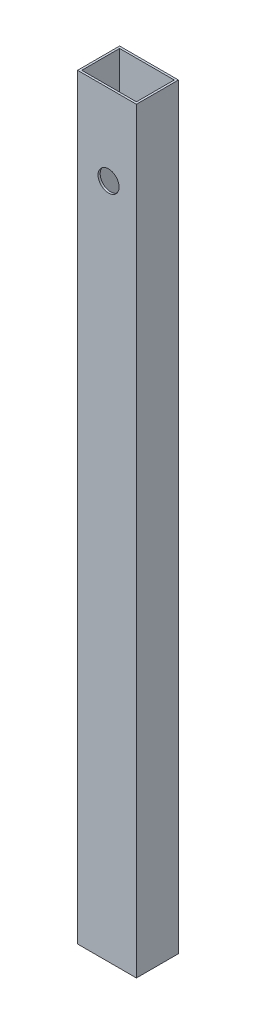
ISO-10303-21;
HEADER;
FILE_DESCRIPTION(('STEP AP214'),'2;1');
FILE_NAME('part.step','',(''),(''),'','','');
FILE_SCHEMA(('AUTOMOTIVE_DESIGN { 1 0 10303 214 1 1 1 1 }'));
ENDSEC;
DATA;
#1=APPLICATION_CONTEXT('core data for automotive mechanical design processes');
#2=APPLICATION_PROTOCOL_DEFINITION('international standard','automotive_design',2000,#1);
#3=PRODUCT_CONTEXT('',#1,'mechanical');
#4=PRODUCT('Part','Part','',(#3));
#5=PRODUCT_RELATED_PRODUCT_CATEGORY('part','',(#4));
#6=PRODUCT_DEFINITION_FORMATION('','',#4);
#7=PRODUCT_DEFINITION_CONTEXT('part definition',#1,'design');
#8=PRODUCT_DEFINITION('design','',#6,#7);
#9=PRODUCT_DEFINITION_SHAPE('','',#8);
#10=(LENGTH_UNIT() NAMED_UNIT(*) SI_UNIT(.MILLI.,.METRE.));
#11=(NAMED_UNIT(*) PLANE_ANGLE_UNIT() SI_UNIT($,.RADIAN.));
#12=(NAMED_UNIT(*) SI_UNIT($,.STERADIAN.) SOLID_ANGLE_UNIT());
#13=UNCERTAINTY_MEASURE_WITH_UNIT(LENGTH_MEASURE(1.E-05),#10,'distance_accuracy_value','');
#14=(GEOMETRIC_REPRESENTATION_CONTEXT(3) GLOBAL_UNCERTAINTY_ASSIGNED_CONTEXT((#13)) GLOBAL_UNIT_ASSIGNED_CONTEXT((#10,
#11,#12)) REPRESENTATION_CONTEXT('',''));
#15=CARTESIAN_POINT('',(0.,0.,0.));
#16=DIRECTION('',(0.,0.,1.));
#17=DIRECTION('',(1.,0.,0.));
#18=AXIS2_PLACEMENT_3D('',#15,#16,#17);
#19=CARTESIAN_POINT('',(17.78,457.2,-12.7));
#20=DIRECTION('',(-1.,0.,0.));
#21=DIRECTION('',(0.,0.,1.));
#22=AXIS2_PLACEMENT_3D('',#19,#20,#21);
#23=PLANE('',#22);
#24=DIRECTION('',(0.,0.,-1.));
#25=VECTOR('',#24,1.);
#26=CARTESIAN_POINT('',(17.78,0.,-12.7));
#27=LINE('',#26,#25);
#28=CARTESIAN_POINT('',(17.78,0.,12.7));
#29=VERTEX_POINT('',#28);
#30=CARTESIAN_POINT('',(17.78,0.,-12.7));
#31=VERTEX_POINT('',#30);
#32=EDGE_CURVE('E159',#29,#31,#27,.T.);
#33=ORIENTED_EDGE('',*,*,#32,.T.);
#34=DIRECTION('',(0.,-1.,0.));
#35=VECTOR('',#34,1.);
#36=CARTESIAN_POINT('',(17.78,457.2,-12.7));
#37=LINE('',#36,#35);
#38=CARTESIAN_POINT('',(17.78,457.2,-12.7));
#39=VERTEX_POINT('',#38);
#40=EDGE_CURVE('E11',#39,#31,#37,.T.);
#41=ORIENTED_EDGE('',*,*,#40,.F.);
#42=DIRECTION('',(0.,0.,-1.));
#43=VECTOR('',#42,1.);
#44=CARTESIAN_POINT('',(17.78,457.2,-12.7));
#45=LINE('',#44,#43);
#46=CARTESIAN_POINT('',(17.78,457.2,12.7));
#47=VERTEX_POINT('',#46);
#48=EDGE_CURVE('E165',#47,#39,#45,.T.);
#49=ORIENTED_EDGE('',*,*,#48,.F.);
#50=DIRECTION('',(0.,-1.,0.));
#51=VECTOR('',#50,1.);
#52=CARTESIAN_POINT('',(17.78,457.2,12.7));
#53=LINE('',#52,#51);
#54=EDGE_CURVE('E179',#47,#29,#53,.T.);
#55=ORIENTED_EDGE('',*,*,#54,.T.);
#56=EDGE_LOOP('',(#33,#41,#49,#55));
#57=FACE_BOUND('',#56,.T.);
#58=ADVANCED_FACE('F47',(#57),#23,.F.);
#59=CARTESIAN_POINT('',(-17.78,457.2,-12.7));
#60=DIRECTION('',(0.,0.,1.));
#61=DIRECTION('',(1.,0.,0.));
#62=AXIS2_PLACEMENT_3D('',#59,#60,#61);
#63=PLANE('',#62);
#64=CARTESIAN_POINT('',(0.954776225867732,408.643423164839,-12.7));
#65=DIRECTION('',(0.,0.,-1.));
#66=DIRECTION('',(-1.,0.,0.));
#67=AXIS2_PLACEMENT_3D('',#64,#65,#66);
#68=CIRCLE('',#67,6.34999999999999);
#69=CARTESIAN_POINT('',(-5.39522377413225,408.643423164839,-12.7));
#70=VERTEX_POINT('',#69);
#71=EDGE_CURVE('E260',#70,#70,#68,.T.);
#72=ORIENTED_EDGE('',*,*,#71,.F.);
#73=EDGE_LOOP('',(#72));
#74=FACE_BOUND('',#73,.T.);
#75=DIRECTION('',(-1.,0.,0.));
#76=VECTOR('',#75,1.);
#77=CARTESIAN_POINT('',(-17.78,0.,-12.7));
#78=LINE('',#77,#76);
#79=CARTESIAN_POINT('',(-17.78,0.,-12.7));
#80=VERTEX_POINT('',#79);
#81=EDGE_CURVE('E183',#31,#80,#78,.T.);
#82=ORIENTED_EDGE('',*,*,#81,.T.);
#83=DIRECTION('',(0.,-1.,0.));
#84=VECTOR('',#83,1.);
#85=CARTESIAN_POINT('',(-17.78,457.2,-12.7));
#86=LINE('',#85,#84);
#87=CARTESIAN_POINT('',(-17.78,457.2,-12.7));
#88=VERTEX_POINT('',#87);
#89=EDGE_CURVE('E55',#88,#80,#86,.T.);
#90=ORIENTED_EDGE('',*,*,#89,.F.);
#91=DIRECTION('',(-1.,0.,0.));
#92=VECTOR('',#91,1.);
#93=CARTESIAN_POINT('',(-17.78,457.2,-12.7));
#94=LINE('',#93,#92);
#95=EDGE_CURVE('E169',#39,#88,#94,.T.);
#96=ORIENTED_EDGE('',*,*,#95,.F.);
#97=ORIENTED_EDGE('',*,*,#40,.T.);
#98=EDGE_LOOP('',(#82,#90,#96,#97));
#99=FACE_BOUND('',#98,.T.);
#100=ADVANCED_FACE('F218',(#74,#99),#63,.F.);
#101=CARTESIAN_POINT('',(-17.78,457.2,-12.7));
#102=DIRECTION('',(1.,0.,0.));
#103=DIRECTION('',(0.,0.,-1.));
#104=AXIS2_PLACEMENT_3D('',#101,#102,#103);
#105=PLANE('',#104);
#106=DIRECTION('',(0.,0.,1.));
#107=VECTOR('',#106,1.);
#108=CARTESIAN_POINT('',(-17.78,0.,-12.7));
#109=LINE('',#108,#107);
#110=CARTESIAN_POINT('',(-17.78,0.,12.7));
#111=VERTEX_POINT('',#110);
#112=EDGE_CURVE('E186',#80,#111,#109,.T.);
#113=ORIENTED_EDGE('',*,*,#112,.T.);
#114=DIRECTION('',(0.,-1.,0.));
#115=VECTOR('',#114,1.);
#116=CARTESIAN_POINT('',(-17.78,457.2,12.7));
#117=LINE('',#116,#115);
#118=CARTESIAN_POINT('',(-17.78,457.2,12.7));
#119=VERTEX_POINT('',#118);
#120=EDGE_CURVE('E194',#119,#111,#117,.T.);
#121=ORIENTED_EDGE('',*,*,#120,.F.);
#122=DIRECTION('',(0.,0.,1.));
#123=VECTOR('',#122,1.);
#124=CARTESIAN_POINT('',(-17.78,457.2,-12.7));
#125=LINE('',#124,#123);
#126=EDGE_CURVE('E173',#88,#119,#125,.T.);
#127=ORIENTED_EDGE('',*,*,#126,.F.);
#128=ORIENTED_EDGE('',*,*,#89,.T.);
#129=EDGE_LOOP('',(#113,#121,#127,#128));
#130=FACE_BOUND('',#129,.T.);
#131=ADVANCED_FACE('F204',(#130),#105,.F.);
#132=CARTESIAN_POINT('',(-17.78,457.2,12.7));
#133=DIRECTION('',(0.,0.,-1.));
#134=DIRECTION('',(-1.,0.,0.));
#135=AXIS2_PLACEMENT_3D('',#132,#133,#134);
#136=PLANE('',#135);
#137=CARTESIAN_POINT('',(0.954776225867864,408.64342316484,12.7));
#138=DIRECTION('',(0.,0.,1.));
#139=DIRECTION('',(1.,0.,0.));
#140=AXIS2_PLACEMENT_3D('',#137,#138,#139);
#141=CIRCLE('',#140,6.34999999999999);
#142=CARTESIAN_POINT('',(7.30477622586786,408.64342316484,12.7));
#143=VERTEX_POINT('',#142);
#144=EDGE_CURVE('E265',#143,#143,#141,.T.);
#145=ORIENTED_EDGE('',*,*,#144,.F.);
#146=EDGE_LOOP('',(#145));
#147=FACE_BOUND('',#146,.T.);
#148=DIRECTION('',(1.,0.,0.));
#149=VECTOR('',#148,1.);
#150=CARTESIAN_POINT('',(-17.78,0.,12.7));
#151=LINE('',#150,#149);
#152=EDGE_CURVE('E170',#111,#29,#151,.T.);
#153=ORIENTED_EDGE('',*,*,#152,.T.);
#154=ORIENTED_EDGE('',*,*,#54,.F.);
#155=DIRECTION('',(1.,0.,0.));
#156=VECTOR('',#155,1.);
#157=CARTESIAN_POINT('',(-17.78,457.2,12.7));
#158=LINE('',#157,#156);
#159=EDGE_CURVE('E176',#119,#47,#158,.T.);
#160=ORIENTED_EDGE('',*,*,#159,.F.);
#161=ORIENTED_EDGE('',*,*,#120,.T.);
#162=EDGE_LOOP('',(#153,#154,#160,#161));
#163=FACE_BOUND('',#162,.T.);
#164=ADVANCED_FACE('F211',(#147,#163),#136,.F.);
#165=CARTESIAN_POINT('',(0.,457.2,0.));
#166=DIRECTION('',(0.,1.,0.));
#167=DIRECTION('',(0.,0.,1.));
#168=AXIS2_PLACEMENT_3D('',#165,#166,#167);
#169=PLANE('',#168);
#170=DIRECTION('',(1.,0.,0.));
#171=VECTOR('',#170,1.);
#172=CARTESIAN_POINT('',(-16.51,457.2,11.43));
#173=LINE('',#172,#171);
#174=CARTESIAN_POINT('',(-16.51,457.2,11.43));
#175=VERTEX_POINT('',#174);
#176=CARTESIAN_POINT('',(16.51,457.2,11.43));
#177=VERTEX_POINT('',#176);
#178=EDGE_CURVE('E62',#175,#177,#173,.T.);
#179=ORIENTED_EDGE('',*,*,#178,.F.);
#180=DIRECTION('',(0.,0.,1.));
#181=VECTOR('',#180,1.);
#182=CARTESIAN_POINT('',(-16.51,457.2,-11.43));
#183=LINE('',#182,#181);
#184=CARTESIAN_POINT('',(-16.51,457.2,-11.43));
#185=VERTEX_POINT('',#184);
#186=EDGE_CURVE('E133',#185,#175,#183,.T.);
#187=ORIENTED_EDGE('',*,*,#186,.F.);
#188=DIRECTION('',(-1.,0.,0.));
#189=VECTOR('',#188,1.);
#190=CARTESIAN_POINT('',(16.51,457.2,-11.43));
#191=LINE('',#190,#189);
#192=CARTESIAN_POINT('',(16.51,457.2,-11.43));
#193=VERTEX_POINT('',#192);
#194=EDGE_CURVE('E138',#193,#185,#191,.T.);
#195=ORIENTED_EDGE('',*,*,#194,.F.);
#196=DIRECTION('',(0.,0.,-1.));
#197=VECTOR('',#196,1.);
#198=CARTESIAN_POINT('',(16.51,457.2,11.43));
#199=LINE('',#198,#197);
#200=EDGE_CURVE('E150',#177,#193,#199,.T.);
#201=ORIENTED_EDGE('',*,*,#200,.F.);
#202=EDGE_LOOP('',(#179,#187,#195,#201));
#203=FACE_BOUND('',#202,.T.);
#204=ORIENTED_EDGE('',*,*,#48,.T.);
#205=ORIENTED_EDGE('',*,*,#95,.T.);
#206=ORIENTED_EDGE('',*,*,#126,.T.);
#207=ORIENTED_EDGE('',*,*,#159,.T.);
#208=EDGE_LOOP('',(#204,#205,#206,#207));
#209=FACE_BOUND('',#208,.T.);
#210=ADVANCED_FACE('F217',(#203,#209),#169,.T.);
#211=CARTESIAN_POINT('',(0.,0.,0.));
#212=DIRECTION('',(0.,1.,0.));
#213=DIRECTION('',(0.,0.,1.));
#214=AXIS2_PLACEMENT_3D('',#211,#212,#213);
#215=PLANE('',#214);
#216=DIRECTION('',(0.,0.,1.));
#217=VECTOR('',#216,1.);
#218=CARTESIAN_POINT('',(-16.51,0.,-11.43));
#219=LINE('',#218,#217);
#220=CARTESIAN_POINT('',(-16.51,0.,-11.43));
#221=VERTEX_POINT('',#220);
#222=CARTESIAN_POINT('',(-16.51,0.,11.43));
#223=VERTEX_POINT('',#222);
#224=EDGE_CURVE('E121',#221,#223,#219,.T.);
#225=ORIENTED_EDGE('',*,*,#224,.T.);
#226=DIRECTION('',(1.,0.,0.));
#227=VECTOR('',#226,1.);
#228=CARTESIAN_POINT('',(-16.51,0.,11.43));
#229=LINE('',#228,#227);
#230=CARTESIAN_POINT('',(16.51,0.,11.43));
#231=VERTEX_POINT('',#230);
#232=EDGE_CURVE('E114',#223,#231,#229,.T.);
#233=ORIENTED_EDGE('',*,*,#232,.T.);
#234=DIRECTION('',(0.,0.,-1.));
#235=VECTOR('',#234,1.);
#236=CARTESIAN_POINT('',(16.51,0.,11.43));
#237=LINE('',#236,#235);
#238=CARTESIAN_POINT('',(16.51,0.,-11.43));
#239=VERTEX_POINT('',#238);
#240=EDGE_CURVE('E124',#231,#239,#237,.T.);
#241=ORIENTED_EDGE('',*,*,#240,.T.);
#242=DIRECTION('',(-1.,0.,0.));
#243=VECTOR('',#242,1.);
#244=CARTESIAN_POINT('',(16.51,0.,-11.43));
#245=LINE('',#244,#243);
#246=EDGE_CURVE('E70',#239,#221,#245,.T.);
#247=ORIENTED_EDGE('',*,*,#246,.T.);
#248=EDGE_LOOP('',(#225,#233,#241,#247));
#249=FACE_BOUND('',#248,.T.);
#250=ORIENTED_EDGE('',*,*,#32,.F.);
#251=ORIENTED_EDGE('',*,*,#152,.F.);
#252=ORIENTED_EDGE('',*,*,#112,.F.);
#253=ORIENTED_EDGE('',*,*,#81,.F.);
#254=EDGE_LOOP('',(#250,#251,#252,#253));
#255=FACE_BOUND('',#254,.T.);
#256=ADVANCED_FACE('F129',(#249,#255),#215,.F.);
#257=CARTESIAN_POINT('',(-16.51,0.,11.43));
#258=DIRECTION('',(0.,0.,1.));
#259=DIRECTION('',(1.,0.,0.));
#260=AXIS2_PLACEMENT_3D('',#257,#258,#259);
#261=PLANE('',#260);
#262=CARTESIAN_POINT('',(0.954776225867864,408.64342316484,11.43));
#263=DIRECTION('',(0.,0.,1.));
#264=DIRECTION('',(1.,0.,0.));
#265=AXIS2_PLACEMENT_3D('',#262,#263,#264);
#266=CIRCLE('',#265,6.34999999999999);
#267=CARTESIAN_POINT('',(7.30477622586786,408.64342316484,11.43));
#268=VERTEX_POINT('',#267);
#269=EDGE_CURVE('E141',#268,#268,#266,.F.);
#270=ORIENTED_EDGE('',*,*,#269,.F.);
#271=EDGE_LOOP('',(#270));
#272=FACE_BOUND('',#271,.T.);
#273=ORIENTED_EDGE('',*,*,#178,.T.);
#274=DIRECTION('',(0.,1.,0.));
#275=VECTOR('',#274,1.);
#276=CARTESIAN_POINT('',(16.51,0.,11.43));
#277=LINE('',#276,#275);
#278=EDGE_CURVE('E110',#231,#177,#277,.T.);
#279=ORIENTED_EDGE('',*,*,#278,.F.);
#280=ORIENTED_EDGE('',*,*,#232,.F.);
#281=DIRECTION('',(0.,1.,0.));
#282=VECTOR('',#281,1.);
#283=CARTESIAN_POINT('',(-16.51,0.,11.43));
#284=LINE('',#283,#282);
#285=EDGE_CURVE('E156',#223,#175,#284,.T.);
#286=ORIENTED_EDGE('',*,*,#285,.T.);
#287=EDGE_LOOP('',(#273,#279,#280,#286));
#288=FACE_BOUND('',#287,.T.);
#289=ADVANCED_FACE('F112',(#272,#288),#261,.F.);
#290=CARTESIAN_POINT('',(-16.51,0.,-11.43));
#291=DIRECTION('',(-1.,0.,0.));
#292=DIRECTION('',(0.,0.,1.));
#293=AXIS2_PLACEMENT_3D('',#290,#291,#292);
#294=PLANE('',#293);
#295=ORIENTED_EDGE('',*,*,#186,.T.);
#296=ORIENTED_EDGE('',*,*,#285,.F.);
#297=ORIENTED_EDGE('',*,*,#224,.F.);
#298=DIRECTION('',(0.,1.,0.));
#299=VECTOR('',#298,1.);
#300=CARTESIAN_POINT('',(-16.51,0.,-11.43));
#301=LINE('',#300,#299);
#302=EDGE_CURVE('E160',#221,#185,#301,.T.);
#303=ORIENTED_EDGE('',*,*,#302,.T.);
#304=EDGE_LOOP('',(#295,#296,#297,#303));
#305=FACE_BOUND('',#304,.T.);
#306=ADVANCED_FACE('F240',(#305),#294,.F.);
#307=CARTESIAN_POINT('',(16.51,0.,-11.43));
#308=DIRECTION('',(0.,0.,-1.));
#309=DIRECTION('',(-1.,0.,0.));
#310=AXIS2_PLACEMENT_3D('',#307,#308,#309);
#311=PLANE('',#310);
#312=CARTESIAN_POINT('',(0.954776225867732,408.643423164839,-11.43));
#313=DIRECTION('',(0.,0.,-1.));
#314=DIRECTION('',(-1.,0.,0.));
#315=AXIS2_PLACEMENT_3D('',#312,#313,#314);
#316=CIRCLE('',#315,6.34999999999999);
#317=CARTESIAN_POINT('',(-5.39522377413225,408.643423164839,-11.43));
#318=VERTEX_POINT('',#317);
#319=EDGE_CURVE('E263',#318,#318,#316,.F.);
#320=ORIENTED_EDGE('',*,*,#319,.F.);
#321=EDGE_LOOP('',(#320));
#322=FACE_BOUND('',#321,.T.);
#323=ORIENTED_EDGE('',*,*,#194,.T.);
#324=ORIENTED_EDGE('',*,*,#302,.F.);
#325=ORIENTED_EDGE('',*,*,#246,.F.);
#326=DIRECTION('',(0.,1.,0.));
#327=VECTOR('',#326,1.);
#328=CARTESIAN_POINT('',(16.51,0.,-11.43));
#329=LINE('',#328,#327);
#330=EDGE_CURVE('E120',#239,#193,#329,.T.);
#331=ORIENTED_EDGE('',*,*,#330,.T.);
#332=EDGE_LOOP('',(#323,#324,#325,#331));
#333=FACE_BOUND('',#332,.T.);
#334=ADVANCED_FACE('F245',(#322,#333),#311,.F.);
#335=CARTESIAN_POINT('',(16.51,0.,11.43));
#336=DIRECTION('',(1.,0.,0.));
#337=DIRECTION('',(0.,0.,-1.));
#338=AXIS2_PLACEMENT_3D('',#335,#336,#337);
#339=PLANE('',#338);
#340=ORIENTED_EDGE('',*,*,#200,.T.);
#341=ORIENTED_EDGE('',*,*,#330,.F.);
#342=ORIENTED_EDGE('',*,*,#240,.F.);
#343=ORIENTED_EDGE('',*,*,#278,.T.);
#344=EDGE_LOOP('',(#340,#341,#342,#343));
#345=FACE_BOUND('',#344,.T.);
#346=ADVANCED_FACE('F125',(#345),#339,.F.);
#347=CARTESIAN_POINT('',(0.954776225867864,408.64342316484,-12.701));
#348=DIRECTION('',(0.,0.,1.));
#349=DIRECTION('',(1.,0.,0.));
#350=AXIS2_PLACEMENT_3D('',#347,#348,#349);
#351=CYLINDRICAL_SURFACE('',#350,6.34999999999999);
#352=CARTESIAN_POINT('',(7.30477622586786,408.64342316484,12.7));
#353=CARTESIAN_POINT('',(7.30477622586786,408.64342316484,12.6867708333333));
#354=CARTESIAN_POINT('',(7.30477622586786,408.64342316484,12.6735416666667));
#355=CARTESIAN_POINT('',(7.30477622586786,408.64342316484,12.6470833333333));
#356=CARTESIAN_POINT('',(7.30477622586786,408.64342316484,12.6338541666667));
#357=CARTESIAN_POINT('',(7.30477622586786,408.64342316484,12.6073958333333));
#358=CARTESIAN_POINT('',(7.30477622586786,408.64342316484,12.5941666666667));
#359=CARTESIAN_POINT('',(7.30477622586786,408.64342316484,12.5677083333333));
#360=CARTESIAN_POINT('',(7.30477622586786,408.64342316484,12.5544791666667));
#361=CARTESIAN_POINT('',(7.30477622586786,408.64342316484,12.5280208333333));
#362=CARTESIAN_POINT('',(7.30477622586786,408.64342316484,12.5147916666667));
#363=CARTESIAN_POINT('',(7.30477622586786,408.64342316484,12.4883333333333));
#364=CARTESIAN_POINT('',(7.30477622586786,408.64342316484,12.4751041666667));
#365=CARTESIAN_POINT('',(7.30477622586786,408.64342316484,12.4486458333333));
#366=CARTESIAN_POINT('',(7.30477622586786,408.64342316484,12.4354166666667));
#367=CARTESIAN_POINT('',(7.30477622586786,408.64342316484,12.4089583333333));
#368=CARTESIAN_POINT('',(7.30477622586786,408.64342316484,12.3957291666667));
#369=CARTESIAN_POINT('',(7.30477622586786,408.64342316484,12.3692708333333));
#370=CARTESIAN_POINT('',(7.30477622586786,408.64342316484,12.3560416666667));
#371=CARTESIAN_POINT('',(7.30477622586786,408.64342316484,12.3295833333333));
#372=CARTESIAN_POINT('',(7.30477622586786,408.64342316484,12.3163541666667));
#373=CARTESIAN_POINT('',(7.30477622586786,408.64342316484,12.2898958333333));
#374=CARTESIAN_POINT('',(7.30477622586786,408.64342316484,12.2766666666667));
#375=CARTESIAN_POINT('',(7.30477622586786,408.64342316484,12.2502083333333));
#376=CARTESIAN_POINT('',(7.30477622586786,408.64342316484,12.2369791666667));
#377=CARTESIAN_POINT('',(7.30477622586786,408.64342316484,12.2105208333333));
#378=CARTESIAN_POINT('',(7.30477622586786,408.64342316484,12.1972916666667));
#379=CARTESIAN_POINT('',(7.30477622586786,408.64342316484,12.1708333333333));
#380=CARTESIAN_POINT('',(7.30477622586786,408.64342316484,12.1576041666667));
#381=CARTESIAN_POINT('',(7.30477622586786,408.64342316484,12.1311458333333));
#382=CARTESIAN_POINT('',(7.30477622586786,408.64342316484,12.1179166666667));
#383=CARTESIAN_POINT('',(7.30477622586786,408.64342316484,12.0914583333333));
#384=CARTESIAN_POINT('',(7.30477622586786,408.64342316484,12.0782291666667));
#385=CARTESIAN_POINT('',(7.30477622586786,408.64342316484,12.0517708333333));
#386=CARTESIAN_POINT('',(7.30477622586786,408.64342316484,12.0385416666667));
#387=CARTESIAN_POINT('',(7.30477622586786,408.64342316484,12.0120833333333));
#388=CARTESIAN_POINT('',(7.30477622586786,408.64342316484,11.9988541666667));
#389=CARTESIAN_POINT('',(7.30477622586786,408.64342316484,11.9723958333333));
#390=CARTESIAN_POINT('',(7.30477622586786,408.64342316484,11.9591666666667));
#391=CARTESIAN_POINT('',(7.30477622586786,408.64342316484,11.9327083333333));
#392=CARTESIAN_POINT('',(7.30477622586786,408.64342316484,11.9194791666667));
#393=CARTESIAN_POINT('',(7.30477622586786,408.64342316484,11.8930208333333));
#394=CARTESIAN_POINT('',(7.30477622586786,408.64342316484,11.8797916666667));
#395=CARTESIAN_POINT('',(7.30477622586786,408.64342316484,11.8533333333333));
#396=CARTESIAN_POINT('',(7.30477622586786,408.64342316484,11.8401041666667));
#397=CARTESIAN_POINT('',(7.30477622586786,408.64342316484,11.8136458333333));
#398=CARTESIAN_POINT('',(7.30477622586786,408.64342316484,11.8004166666667));
#399=CARTESIAN_POINT('',(7.30477622586786,408.64342316484,11.7739583333333));
#400=CARTESIAN_POINT('',(7.30477622586786,408.64342316484,11.7607291666667));
#401=CARTESIAN_POINT('',(7.30477622586786,408.64342316484,11.7342708333333));
#402=CARTESIAN_POINT('',(7.30477622586786,408.64342316484,11.7210416666667));
#403=CARTESIAN_POINT('',(7.30477622586786,408.64342316484,11.6945833333333));
#404=CARTESIAN_POINT('',(7.30477622586786,408.64342316484,11.6813541666667));
#405=CARTESIAN_POINT('',(7.30477622586786,408.64342316484,11.6548958333333));
#406=CARTESIAN_POINT('',(7.30477622586786,408.64342316484,11.6416666666667));
#407=CARTESIAN_POINT('',(7.30477622586786,408.64342316484,11.6152083333333));
#408=CARTESIAN_POINT('',(7.30477622586786,408.64342316484,11.6019791666667));
#409=CARTESIAN_POINT('',(7.30477622586786,408.64342316484,11.5755208333333));
#410=CARTESIAN_POINT('',(7.30477622586786,408.64342316484,11.5622916666667));
#411=CARTESIAN_POINT('',(7.30477622586786,408.64342316484,11.5358333333333));
#412=CARTESIAN_POINT('',(7.30477622586786,408.64342316484,11.5226041666667));
#413=CARTESIAN_POINT('',(7.30477622586786,408.64342316484,11.4961458333333));
#414=CARTESIAN_POINT('',(7.30477622586786,408.64342316484,11.4829166666667));
#415=CARTESIAN_POINT('',(7.30477622586786,408.64342316484,11.4564583333333));
#416=CARTESIAN_POINT('',(7.30477622586786,408.64342316484,11.4432291666667));
#417=CARTESIAN_POINT('',(7.30477622586786,408.64342316484,11.43));
#418=B_SPLINE_CURVE_WITH_KNOTS('',3,(#352,#353,#354,#355,#356,#357,#358,#359,#360,#361,#362,
#363,#364,#365,#366,#367,#368,#369,#370,#371,#372,#373,#374,#375,#376,#377,#378,#379,#380,#381,
#382,#383,#384,#385,#386,#387,#388,#389,#390,#391,#392,#393,#394,#395,#396,#397,#398,#399,#400,
#401,#402,#403,#404,#405,#406,#407,#408,#409,#410,#411,#412,#413,#414,#415,#416,#417),
.UNSPECIFIED.,.F.,.F.,(4,2,2,2,2,2,2,2,2,2,2,2,2,2,2,2,2,2,2,2,2,2,2,2,2,2,2,2,2,2,2,2,4),(0.,
0.0396874999999998,0.0793749999999996,0.119062499999999,0.158749999999999,0.198437499999999,
0.238124999999999,0.277812499999999,0.317499999999998,0.357187500000002,0.396875000000001,
0.436562500000001,0.476250000000001,0.515937500000001,0.555625000000001,0.5953125,0.635,
0.6746875,0.714375,0.7540625,0.793749999999999,0.833437499999999,0.873124999999999,
0.912812499999999,0.952500000000002,0.992187500000002,1.031875,1.0715625,1.11125,1.1509375,
1.190625,1.2303125,1.27),.UNSPECIFIED.);
#419=EDGE_CURVE('BSEAM244',#143,#268,#418,.T.);
#420=ORIENTED_EDGE('',*,*,#144,.T.);
#421=ORIENTED_EDGE('',*,*,#269,.T.);
#422=ORIENTED_EDGE('',*,*,#419,.T.);
#423=ORIENTED_EDGE('',*,*,#419,.F.);
#424=EDGE_LOOP('',(#420,#422,#421,#423));
#425=FACE_BOUND('',#424,.T.);
#426=ADVANCED_FACE('F244',(#425),#351,.F.);
#427=CARTESIAN_POINT('',(0.954776225867732,408.643423164839,12.701));
#428=DIRECTION('',(0.,0.,-1.));
#429=DIRECTION('',(-1.,0.,0.));
#430=AXIS2_PLACEMENT_3D('',#427,#428,#429);
#431=CYLINDRICAL_SURFACE('',#430,6.34999999999999);
#432=CARTESIAN_POINT('',(-5.39522377413225,408.643423164839,-12.7));
#433=CARTESIAN_POINT('',(-5.39522377413225,408.643423164839,-12.6867708333333));
#434=CARTESIAN_POINT('',(-5.39522377413225,408.643423164839,-12.6735416666667));
#435=CARTESIAN_POINT('',(-5.39522377413225,408.643423164839,-12.6470833333333));
#436=CARTESIAN_POINT('',(-5.39522377413225,408.643423164839,-12.6338541666667));
#437=CARTESIAN_POINT('',(-5.39522377413225,408.643423164839,-12.6073958333333));
#438=CARTESIAN_POINT('',(-5.39522377413225,408.643423164839,-12.5941666666667));
#439=CARTESIAN_POINT('',(-5.39522377413225,408.643423164839,-12.5677083333333));
#440=CARTESIAN_POINT('',(-5.39522377413225,408.643423164839,-12.5544791666667));
#441=CARTESIAN_POINT('',(-5.39522377413225,408.643423164839,-12.5280208333333));
#442=CARTESIAN_POINT('',(-5.39522377413225,408.643423164839,-12.5147916666667));
#443=CARTESIAN_POINT('',(-5.39522377413225,408.643423164839,-12.4883333333333));
#444=CARTESIAN_POINT('',(-5.39522377413225,408.643423164839,-12.4751041666667));
#445=CARTESIAN_POINT('',(-5.39522377413225,408.643423164839,-12.4486458333333));
#446=CARTESIAN_POINT('',(-5.39522377413225,408.643423164839,-12.4354166666667));
#447=CARTESIAN_POINT('',(-5.39522377413225,408.643423164839,-12.4089583333333));
#448=CARTESIAN_POINT('',(-5.39522377413225,408.643423164839,-12.3957291666667));
#449=CARTESIAN_POINT('',(-5.39522377413225,408.643423164839,-12.3692708333333));
#450=CARTESIAN_POINT('',(-5.39522377413225,408.643423164839,-12.3560416666667));
#451=CARTESIAN_POINT('',(-5.39522377413225,408.643423164839,-12.3295833333333));
#452=CARTESIAN_POINT('',(-5.39522377413225,408.643423164839,-12.3163541666667));
#453=CARTESIAN_POINT('',(-5.39522377413225,408.643423164839,-12.2898958333333));
#454=CARTESIAN_POINT('',(-5.39522377413225,408.643423164839,-12.2766666666667));
#455=CARTESIAN_POINT('',(-5.39522377413225,408.643423164839,-12.2502083333333));
#456=CARTESIAN_POINT('',(-5.39522377413225,408.643423164839,-12.2369791666667));
#457=CARTESIAN_POINT('',(-5.39522377413225,408.643423164839,-12.2105208333333));
#458=CARTESIAN_POINT('',(-5.39522377413225,408.643423164839,-12.1972916666667));
#459=CARTESIAN_POINT('',(-5.39522377413225,408.643423164839,-12.1708333333333));
#460=CARTESIAN_POINT('',(-5.39522377413225,408.643423164839,-12.1576041666667));
#461=CARTESIAN_POINT('',(-5.39522377413225,408.643423164839,-12.1311458333333));
#462=CARTESIAN_POINT('',(-5.39522377413225,408.643423164839,-12.1179166666667));
#463=CARTESIAN_POINT('',(-5.39522377413225,408.643423164839,-12.0914583333333));
#464=CARTESIAN_POINT('',(-5.39522377413225,408.643423164839,-12.0782291666667));
#465=CARTESIAN_POINT('',(-5.39522377413225,408.643423164839,-12.0517708333333));
#466=CARTESIAN_POINT('',(-5.39522377413225,408.643423164839,-12.0385416666667));
#467=CARTESIAN_POINT('',(-5.39522377413225,408.643423164839,-12.0120833333333));
#468=CARTESIAN_POINT('',(-5.39522377413225,408.643423164839,-11.9988541666667));
#469=CARTESIAN_POINT('',(-5.39522377413225,408.643423164839,-11.9723958333333));
#470=CARTESIAN_POINT('',(-5.39522377413225,408.643423164839,-11.9591666666667));
#471=CARTESIAN_POINT('',(-5.39522377413225,408.643423164839,-11.9327083333333));
#472=CARTESIAN_POINT('',(-5.39522377413225,408.643423164839,-11.9194791666667));
#473=CARTESIAN_POINT('',(-5.39522377413225,408.643423164839,-11.8930208333333));
#474=CARTESIAN_POINT('',(-5.39522377413225,408.643423164839,-11.8797916666667));
#475=CARTESIAN_POINT('',(-5.39522377413225,408.643423164839,-11.8533333333333));
#476=CARTESIAN_POINT('',(-5.39522377413225,408.643423164839,-11.8401041666667));
#477=CARTESIAN_POINT('',(-5.39522377413225,408.643423164839,-11.8136458333333));
#478=CARTESIAN_POINT('',(-5.39522377413225,408.643423164839,-11.8004166666667));
#479=CARTESIAN_POINT('',(-5.39522377413225,408.643423164839,-11.7739583333333));
#480=CARTESIAN_POINT('',(-5.39522377413225,408.643423164839,-11.7607291666667));
#481=CARTESIAN_POINT('',(-5.39522377413225,408.643423164839,-11.7342708333333));
#482=CARTESIAN_POINT('',(-5.39522377413225,408.643423164839,-11.7210416666667));
#483=CARTESIAN_POINT('',(-5.39522377413225,408.643423164839,-11.6945833333333));
#484=CARTESIAN_POINT('',(-5.39522377413225,408.643423164839,-11.6813541666667));
#485=CARTESIAN_POINT('',(-5.39522377413225,408.643423164839,-11.6548958333333));
#486=CARTESIAN_POINT('',(-5.39522377413225,408.643423164839,-11.6416666666667));
#487=CARTESIAN_POINT('',(-5.39522377413225,408.643423164839,-11.6152083333333));
#488=CARTESIAN_POINT('',(-5.39522377413225,408.643423164839,-11.6019791666667));
#489=CARTESIAN_POINT('',(-5.39522377413225,408.643423164839,-11.5755208333333));
#490=CARTESIAN_POINT('',(-5.39522377413225,408.643423164839,-11.5622916666667));
#491=CARTESIAN_POINT('',(-5.39522377413225,408.643423164839,-11.5358333333333));
#492=CARTESIAN_POINT('',(-5.39522377413225,408.643423164839,-11.5226041666667));
#493=CARTESIAN_POINT('',(-5.39522377413225,408.643423164839,-11.4961458333333));
#494=CARTESIAN_POINT('',(-5.39522377413225,408.643423164839,-11.4829166666667));
#495=CARTESIAN_POINT('',(-5.39522377413225,408.643423164839,-11.4564583333333));
#496=CARTESIAN_POINT('',(-5.39522377413225,408.643423164839,-11.4432291666667));
#497=CARTESIAN_POINT('',(-5.39522377413225,408.643423164839,-11.43));
#498=B_SPLINE_CURVE_WITH_KNOTS('',3,(#432,#433,#434,#435,#436,#437,#438,#439,#440,#441,#442,
#443,#444,#445,#446,#447,#448,#449,#450,#451,#452,#453,#454,#455,#456,#457,#458,#459,#460,#461,
#462,#463,#464,#465,#466,#467,#468,#469,#470,#471,#472,#473,#474,#475,#476,#477,#478,#479,#480,
#481,#482,#483,#484,#485,#486,#487,#488,#489,#490,#491,#492,#493,#494,#495,#496,#497),
.UNSPECIFIED.,.F.,.F.,(4,2,2,2,2,2,2,2,2,2,2,2,2,2,2,2,2,2,2,2,2,2,2,2,2,2,2,2,2,2,2,2,4),(0.,
0.0396874999999998,0.0793749999999996,0.119062499999999,0.158749999999999,0.198437499999999,
0.238124999999999,0.277812499999999,0.317499999999998,0.357187500000002,0.396875000000001,
0.436562500000001,0.476250000000001,0.515937500000001,0.555625000000001,0.5953125,0.635,
0.6746875,0.714375,0.7540625,0.793749999999999,0.833437499999999,0.873124999999999,
0.912812499999999,0.952500000000002,0.992187500000002,1.031875,1.0715625,1.11125,1.1509375,
1.190625,1.2303125,1.27),.UNSPECIFIED.);
#499=EDGE_CURVE('BSEAM252',#70,#318,#498,.T.);
#500=ORIENTED_EDGE('',*,*,#71,.T.);
#501=ORIENTED_EDGE('',*,*,#319,.T.);
#502=ORIENTED_EDGE('',*,*,#499,.T.);
#503=ORIENTED_EDGE('',*,*,#499,.F.);
#504=EDGE_LOOP('',(#500,#502,#501,#503));
#505=FACE_BOUND('',#504,.T.);
#506=ADVANCED_FACE('F252',(#505),#431,.F.);
#507=CLOSED_SHELL('',(#58,#100,#131,#164,#210,#256,#289,#306,#334,#346,#426,#506));
#508=MANIFOLD_SOLID_BREP('B2',#507);
#509=ADVANCED_BREP_SHAPE_REPRESENTATION('',(#18,#508),#14);
#510=SHAPE_DEFINITION_REPRESENTATION(#9,#509);
ENDSEC;
END-ISO-10303-21;
